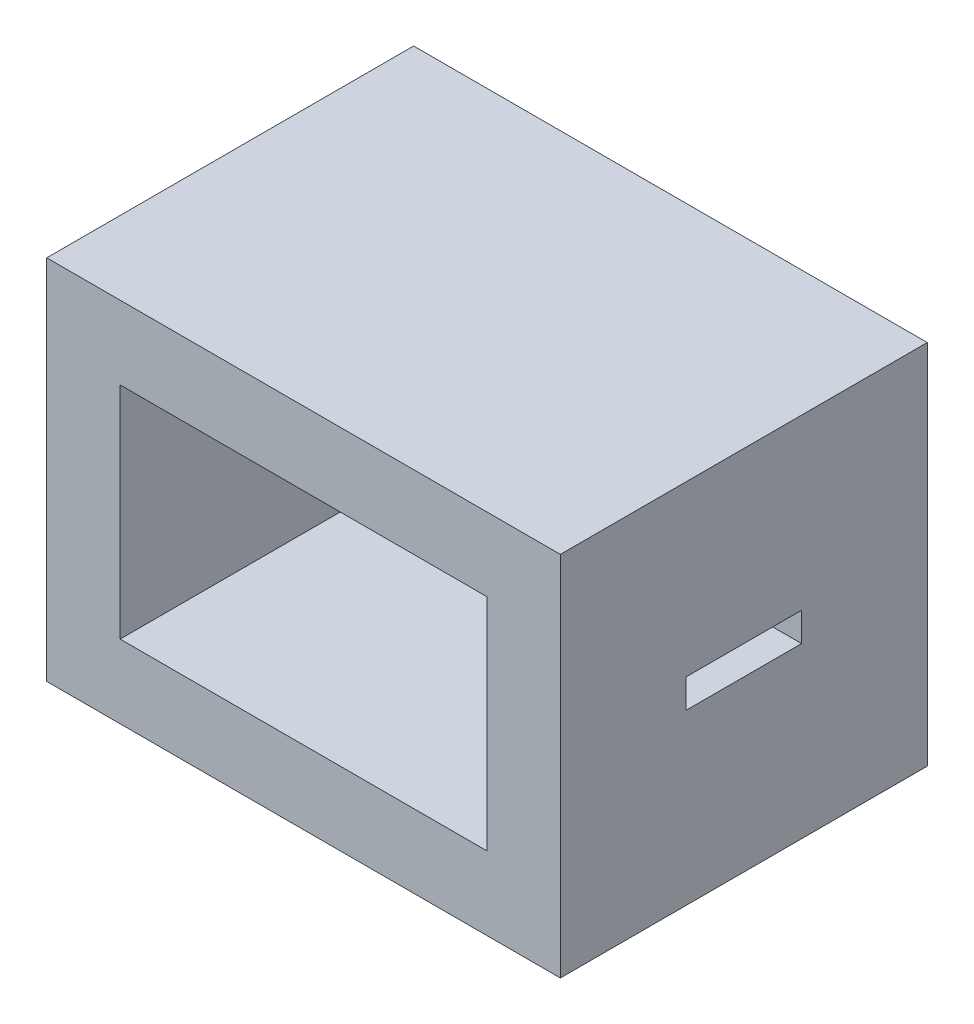
ISO-10303-21;
HEADER;
FILE_DESCRIPTION(('STEP AP214'),'2;1');
FILE_NAME('part.step','',(''),(''),'','','');
FILE_SCHEMA(('AUTOMOTIVE_DESIGN { 1 0 10303 214 1 1 1 1 }'));
ENDSEC;
DATA;
#1=APPLICATION_CONTEXT('core data for automotive mechanical design processes');
#2=APPLICATION_PROTOCOL_DEFINITION('international standard','automotive_design',2000,#1);
#3=PRODUCT_CONTEXT('',#1,'mechanical');
#4=PRODUCT('Part','Part','',(#3));
#5=PRODUCT_RELATED_PRODUCT_CATEGORY('part','',(#4));
#6=PRODUCT_DEFINITION_FORMATION('','',#4);
#7=PRODUCT_DEFINITION_CONTEXT('part definition',#1,'design');
#8=PRODUCT_DEFINITION('design','',#6,#7);
#9=PRODUCT_DEFINITION_SHAPE('','',#8);
#10=(LENGTH_UNIT() NAMED_UNIT(*) SI_UNIT(.MILLI.,.METRE.));
#11=(NAMED_UNIT(*) PLANE_ANGLE_UNIT() SI_UNIT($,.RADIAN.));
#12=(NAMED_UNIT(*) SI_UNIT($,.STERADIAN.) SOLID_ANGLE_UNIT());
#13=UNCERTAINTY_MEASURE_WITH_UNIT(LENGTH_MEASURE(1.E-05),#10,'distance_accuracy_value','');
#14=(GEOMETRIC_REPRESENTATION_CONTEXT(3) GLOBAL_UNCERTAINTY_ASSIGNED_CONTEXT((#13)) GLOBAL_UNIT_ASSIGNED_CONTEXT((#10,
#11,#12)) REPRESENTATION_CONTEXT('',''));
#15=CARTESIAN_POINT('',(0.,0.,0.));
#16=DIRECTION('',(0.,0.,1.));
#17=DIRECTION('',(1.,0.,0.));
#18=AXIS2_PLACEMENT_3D('',#15,#16,#17);
#19=CARTESIAN_POINT('',(2.54,0.,0.));
#20=DIRECTION('',(1.,0.,0.));
#21=DIRECTION('',(0.,0.,-1.));
#22=AXIS2_PLACEMENT_3D('',#19,#20,#21);
#23=PLANE('',#22);
#24=DIRECTION('',(0.,1.,0.));
#25=VECTOR('',#24,1.);
#26=CARTESIAN_POINT('',(2.54,0.5,-2.));
#27=LINE('',#26,#25);
#28=CARTESIAN_POINT('',(2.54,-0.5,-2.));
#29=VERTEX_POINT('',#28);
#30=CARTESIAN_POINT('',(2.54,0.5,-2.));
#31=VERTEX_POINT('',#30);
#32=EDGE_CURVE('E272',#29,#31,#27,.T.);
#33=ORIENTED_EDGE('',*,*,#32,.F.);
#34=DIRECTION('',(0.,0.,-1.));
#35=VECTOR('',#34,1.);
#36=CARTESIAN_POINT('',(2.54,-0.5,2.));
#37=LINE('',#36,#35);
#38=CARTESIAN_POINT('',(2.54,-0.5,2.));
#39=VERTEX_POINT('',#38);
#40=EDGE_CURVE('E278',#39,#29,#37,.T.);
#41=ORIENTED_EDGE('',*,*,#40,.F.);
#42=DIRECTION('',(0.,-1.,0.));
#43=VECTOR('',#42,1.);
#44=CARTESIAN_POINT('',(2.54,0.5,2.));
#45=LINE('',#44,#43);
#46=CARTESIAN_POINT('',(2.54,0.5,2.));
#47=VERTEX_POINT('',#46);
#48=EDGE_CURVE('E296',#47,#39,#45,.T.);
#49=ORIENTED_EDGE('',*,*,#48,.F.);
#50=DIRECTION('',(0.,0.,1.));
#51=VECTOR('',#50,1.);
#52=CARTESIAN_POINT('',(2.54,0.5,2.));
#53=LINE('',#52,#51);
#54=EDGE_CURVE('E292',#31,#47,#53,.T.);
#55=ORIENTED_EDGE('',*,*,#54,.F.);
#56=EDGE_LOOP('',(#33,#41,#49,#55));
#57=FACE_BOUND('',#56,.T.);
#58=DIRECTION('',(0.,0.,-1.));
#59=VECTOR('',#58,1.);
#60=CARTESIAN_POINT('',(2.54,-3.81,6.35));
#61=LINE('',#60,#59);
#62=CARTESIAN_POINT('',(2.54,-3.81,6.35));
#63=VERTEX_POINT('',#62);
#64=CARTESIAN_POINT('',(2.54,-3.81,-3.81));
#65=VERTEX_POINT('',#64);
#66=EDGE_CURVE('E249',#63,#65,#61,.T.);
#67=ORIENTED_EDGE('',*,*,#66,.T.);
#68=DIRECTION('',(0.,1.,0.));
#69=VECTOR('',#68,1.);
#70=CARTESIAN_POINT('',(2.54,3.81,-3.81));
#71=LINE('',#70,#69);
#72=CARTESIAN_POINT('',(2.54,3.81,-3.81));
#73=VERTEX_POINT('',#72);
#74=EDGE_CURVE('E241',#65,#73,#71,.T.);
#75=ORIENTED_EDGE('',*,*,#74,.T.);
#76=DIRECTION('',(0.,0.,1.));
#77=VECTOR('',#76,1.);
#78=CARTESIAN_POINT('',(2.54,3.81,-6.35));
#79=LINE('',#78,#77);
#80=CARTESIAN_POINT('',(2.54,3.81,6.35));
#81=VERTEX_POINT('',#80);
#82=EDGE_CURVE('E261',#73,#81,#79,.T.);
#83=ORIENTED_EDGE('',*,*,#82,.T.);
#84=DIRECTION('',(0.,-1.,0.));
#85=VECTOR('',#84,1.);
#86=CARTESIAN_POINT('',(2.54,6.35,6.35));
#87=LINE('',#86,#85);
#88=EDGE_CURVE('E316',#81,#63,#87,.T.);
#89=ORIENTED_EDGE('',*,*,#88,.T.);
#90=EDGE_LOOP('',(#67,#75,#83,#89));
#91=FACE_BOUND('',#90,.T.);
#92=ADVANCED_FACE('F49',(#57,#91),#23,.T.);
#93=CARTESIAN_POINT('',(0.,3.81,0.));
#94=DIRECTION('',(0.,1.,0.));
#95=DIRECTION('',(0.,0.,1.));
#96=AXIS2_PLACEMENT_3D('',#93,#94,#95);
#97=PLANE('',#96);
#98=DIRECTION('',(1.,0.,0.));
#99=VECTOR('',#98,1.);
#100=CARTESIAN_POINT('',(15.24,3.81,-3.81));
#101=LINE('',#100,#99);
#102=CARTESIAN_POINT('',(15.24,3.81,-3.81));
#103=VERTEX_POINT('',#102);
#104=EDGE_CURVE('E245',#73,#103,#101,.T.);
#105=ORIENTED_EDGE('',*,*,#104,.T.);
#106=DIRECTION('',(0.,0.,-1.));
#107=VECTOR('',#106,1.);
#108=CARTESIAN_POINT('',(15.24,3.81,-6.35));
#109=LINE('',#108,#107);
#110=CARTESIAN_POINT('',(15.24,3.81,6.35));
#111=VERTEX_POINT('',#110);
#112=EDGE_CURVE('E268',#111,#103,#109,.T.);
#113=ORIENTED_EDGE('',*,*,#112,.F.);
#114=DIRECTION('',(1.,0.,0.));
#115=VECTOR('',#114,1.);
#116=CARTESIAN_POINT('',(2.54,3.81,6.35));
#117=LINE('',#116,#115);
#118=EDGE_CURVE('E264',#81,#111,#117,.T.);
#119=ORIENTED_EDGE('',*,*,#118,.F.);
#120=ORIENTED_EDGE('',*,*,#82,.F.);
#121=EDGE_LOOP('',(#105,#113,#119,#120));
#122=FACE_BOUND('',#121,.T.);
#123=ADVANCED_FACE('F365',(#122),#97,.F.);
#124=CARTESIAN_POINT('',(0.,-3.81,0.));
#125=DIRECTION('',(0.,-1.,0.));
#126=DIRECTION('',(0.,0.,-1.));
#127=AXIS2_PLACEMENT_3D('',#124,#125,#126);
#128=PLANE('',#127);
#129=DIRECTION('',(-1.,0.,0.));
#130=VECTOR('',#129,1.);
#131=CARTESIAN_POINT('',(15.24,-3.81,-3.81));
#132=LINE('',#131,#130);
#133=CARTESIAN_POINT('',(15.24,-3.81,-3.81));
#134=VERTEX_POINT('',#133);
#135=EDGE_CURVE('E237',#134,#65,#132,.T.);
#136=ORIENTED_EDGE('',*,*,#135,.T.);
#137=ORIENTED_EDGE('',*,*,#66,.F.);
#138=DIRECTION('',(-1.,0.,0.));
#139=VECTOR('',#138,1.);
#140=CARTESIAN_POINT('',(2.54,-3.81,6.35));
#141=LINE('',#140,#139);
#142=CARTESIAN_POINT('',(15.24,-3.81,6.35));
#143=VERTEX_POINT('',#142);
#144=EDGE_CURVE('E257',#143,#63,#141,.T.);
#145=ORIENTED_EDGE('',*,*,#144,.F.);
#146=DIRECTION('',(0.,0.,1.));
#147=VECTOR('',#146,1.);
#148=CARTESIAN_POINT('',(15.24,-3.81,6.35));
#149=LINE('',#148,#147);
#150=EDGE_CURVE('E253',#134,#143,#149,.T.);
#151=ORIENTED_EDGE('',*,*,#150,.F.);
#152=EDGE_LOOP('',(#136,#137,#145,#151));
#153=FACE_BOUND('',#152,.T.);
#154=ADVANCED_FACE('F363',(#153),#128,.F.);
#155=CARTESIAN_POINT('',(2.54,6.35,-6.35));
#156=DIRECTION('',(0.,0.,1.));
#157=DIRECTION('',(0.,-1.,0.));
#158=AXIS2_PLACEMENT_3D('',#155,#156,#157);
#159=PLANE('',#158);
#160=DIRECTION('',(0.,1.,0.));
#161=VECTOR('',#160,1.);
#162=CARTESIAN_POINT('',(0.,6.35,-6.35));
#163=LINE('',#162,#161);
#164=CARTESIAN_POINT('',(0.,-6.35,-6.35));
#165=VERTEX_POINT('',#164);
#166=CARTESIAN_POINT('',(0.,6.35,-6.35));
#167=VERTEX_POINT('',#166);
#168=EDGE_CURVE('E306',#165,#167,#163,.T.);
#169=ORIENTED_EDGE('',*,*,#168,.T.);
#170=DIRECTION('',(-1.,0.,0.));
#171=VECTOR('',#170,1.);
#172=CARTESIAN_POINT('',(2.54,6.35,-6.35));
#173=LINE('',#172,#171);
#174=CARTESIAN_POINT('',(17.78,6.35,-6.35));
#175=VERTEX_POINT('',#174);
#176=EDGE_CURVE('E11',#175,#167,#173,.T.);
#177=ORIENTED_EDGE('',*,*,#176,.F.);
#178=DIRECTION('',(0.,1.,0.));
#179=VECTOR('',#178,1.);
#180=CARTESIAN_POINT('',(17.78,6.35,-6.35));
#181=LINE('',#180,#179);
#182=CARTESIAN_POINT('',(17.78,-6.35,-6.35));
#183=VERTEX_POINT('',#182);
#184=EDGE_CURVE('E223',#183,#175,#181,.T.);
#185=ORIENTED_EDGE('',*,*,#184,.F.);
#186=DIRECTION('',(-1.,0.,0.));
#187=VECTOR('',#186,1.);
#188=CARTESIAN_POINT('',(2.54,-6.35,-6.35));
#189=LINE('',#188,#187);
#190=EDGE_CURVE('E319',#183,#165,#189,.T.);
#191=ORIENTED_EDGE('',*,*,#190,.T.);
#192=EDGE_LOOP('',(#169,#177,#185,#191));
#193=FACE_BOUND('',#192,.T.);
#194=ADVANCED_FACE('F51',(#193),#159,.F.);
#195=CARTESIAN_POINT('',(2.54,6.35,6.35));
#196=DIRECTION('',(0.,-1.,0.));
#197=DIRECTION('',(0.,0.,-1.));
#198=AXIS2_PLACEMENT_3D('',#195,#196,#197);
#199=PLANE('',#198);
#200=DIRECTION('',(0.,0.,1.));
#201=VECTOR('',#200,1.);
#202=CARTESIAN_POINT('',(0.,6.35,6.35));
#203=LINE('',#202,#201);
#204=CARTESIAN_POINT('',(0.,6.35,6.35));
#205=VERTEX_POINT('',#204);
#206=EDGE_CURVE('E324',#167,#205,#203,.T.);
#207=ORIENTED_EDGE('',*,*,#206,.T.);
#208=DIRECTION('',(-1.,0.,0.));
#209=VECTOR('',#208,1.);
#210=CARTESIAN_POINT('',(2.54,6.35,6.35));
#211=LINE('',#210,#209);
#212=CARTESIAN_POINT('',(17.78,6.35,6.35));
#213=VERTEX_POINT('',#212);
#214=EDGE_CURVE('E58',#213,#205,#211,.T.);
#215=ORIENTED_EDGE('',*,*,#214,.F.);
#216=DIRECTION('',(0.,0.,1.));
#217=VECTOR('',#216,1.);
#218=CARTESIAN_POINT('',(17.78,6.35,6.35));
#219=LINE('',#218,#217);
#220=EDGE_CURVE('E227',#175,#213,#219,.T.);
#221=ORIENTED_EDGE('',*,*,#220,.F.);
#222=ORIENTED_EDGE('',*,*,#176,.T.);
#223=EDGE_LOOP('',(#207,#215,#221,#222));
#224=FACE_BOUND('',#223,.T.);
#225=ADVANCED_FACE('F357',(#224),#199,.F.);
#226=CARTESIAN_POINT('',(2.54,6.35,6.35));
#227=DIRECTION('',(0.,0.,-1.));
#228=DIRECTION('',(0.,1.,0.));
#229=AXIS2_PLACEMENT_3D('',#226,#227,#228);
#230=PLANE('',#229);
#231=DIRECTION('',(0.,-1.,0.));
#232=VECTOR('',#231,1.);
#233=CARTESIAN_POINT('',(17.78,6.35,6.35));
#234=LINE('',#233,#232);
#235=CARTESIAN_POINT('',(17.78,-6.35,6.35));
#236=VERTEX_POINT('',#235);
#237=EDGE_CURVE('E215',#213,#236,#234,.T.);
#238=ORIENTED_EDGE('',*,*,#237,.F.);
#239=ORIENTED_EDGE('',*,*,#214,.T.);
#240=DIRECTION('',(0.,-1.,0.));
#241=VECTOR('',#240,1.);
#242=CARTESIAN_POINT('',(0.,6.35,6.35));
#243=LINE('',#242,#241);
#244=CARTESIAN_POINT('',(0.,-6.35,6.35));
#245=VERTEX_POINT('',#244);
#246=EDGE_CURVE('E327',#205,#245,#243,.T.);
#247=ORIENTED_EDGE('',*,*,#246,.T.);
#248=DIRECTION('',(-1.,0.,0.));
#249=VECTOR('',#248,1.);
#250=CARTESIAN_POINT('',(2.54,-6.35,6.35));
#251=LINE('',#250,#249);
#252=EDGE_CURVE('E335',#236,#245,#251,.T.);
#253=ORIENTED_EDGE('',*,*,#252,.F.);
#254=EDGE_LOOP('',(#238,#239,#247,#253));
#255=FACE_BOUND('',#254,.T.);
#256=ORIENTED_EDGE('',*,*,#118,.T.);
#257=DIRECTION('',(0.,-1.,0.));
#258=VECTOR('',#257,1.);
#259=CARTESIAN_POINT('',(15.24,6.35,6.35));
#260=LINE('',#259,#258);
#261=EDGE_CURVE('E209',#111,#143,#260,.T.);
#262=ORIENTED_EDGE('',*,*,#261,.T.);
#263=ORIENTED_EDGE('',*,*,#144,.T.);
#264=ORIENTED_EDGE('',*,*,#88,.F.);
#265=EDGE_LOOP('',(#256,#262,#263,#264));
#266=FACE_BOUND('',#265,.T.);
#267=ADVANCED_FACE('F344',(#255,#266),#230,.F.);
#268=CARTESIAN_POINT('',(2.54,-6.35,6.35));
#269=DIRECTION('',(0.,1.,0.));
#270=DIRECTION('',(0.,0.,1.));
#271=AXIS2_PLACEMENT_3D('',#268,#269,#270);
#272=PLANE('',#271);
#273=DIRECTION('',(0.,0.,-1.));
#274=VECTOR('',#273,1.);
#275=CARTESIAN_POINT('',(0.,-6.35,6.35));
#276=LINE('',#275,#274);
#277=EDGE_CURVE('E320',#245,#165,#276,.T.);
#278=ORIENTED_EDGE('',*,*,#277,.T.);
#279=ORIENTED_EDGE('',*,*,#190,.F.);
#280=DIRECTION('',(0.,0.,-1.));
#281=VECTOR('',#280,1.);
#282=CARTESIAN_POINT('',(17.78,-6.35,6.35));
#283=LINE('',#282,#281);
#284=EDGE_CURVE('E219',#236,#183,#283,.T.);
#285=ORIENTED_EDGE('',*,*,#284,.F.);
#286=ORIENTED_EDGE('',*,*,#252,.T.);
#287=EDGE_LOOP('',(#278,#279,#285,#286));
#288=FACE_BOUND('',#287,.T.);
#289=ADVANCED_FACE('F353',(#288),#272,.F.);
#290=CARTESIAN_POINT('',(0.,0.,0.));
#291=DIRECTION('',(1.,0.,0.));
#292=DIRECTION('',(0.,0.,-1.));
#293=AXIS2_PLACEMENT_3D('',#290,#291,#292);
#294=PLANE('',#293);
#295=DIRECTION('',(0.,0.,-1.));
#296=VECTOR('',#295,1.);
#297=CARTESIAN_POINT('',(0.,-0.5,2.));
#298=LINE('',#297,#296);
#299=CARTESIAN_POINT('',(0.,-0.5,2.));
#300=VERTEX_POINT('',#299);
#301=CARTESIAN_POINT('',(0.,-0.5,-2.));
#302=VERTEX_POINT('',#301);
#303=EDGE_CURVE('E286',#300,#302,#298,.T.);
#304=ORIENTED_EDGE('',*,*,#303,.T.);
#305=DIRECTION('',(0.,1.,0.));
#306=VECTOR('',#305,1.);
#307=CARTESIAN_POINT('',(0.,0.5,-2.));
#308=LINE('',#307,#306);
#309=CARTESIAN_POINT('',(0.,0.5,-2.));
#310=VERTEX_POINT('',#309);
#311=EDGE_CURVE('E273',#302,#310,#308,.T.);
#312=ORIENTED_EDGE('',*,*,#311,.T.);
#313=DIRECTION('',(0.,0.,1.));
#314=VECTOR('',#313,1.);
#315=CARTESIAN_POINT('',(0.,0.5,2.));
#316=LINE('',#315,#314);
#317=CARTESIAN_POINT('',(0.,0.5,2.));
#318=VERTEX_POINT('',#317);
#319=EDGE_CURVE('E277',#310,#318,#316,.T.);
#320=ORIENTED_EDGE('',*,*,#319,.T.);
#321=DIRECTION('',(0.,-1.,0.));
#322=VECTOR('',#321,1.);
#323=CARTESIAN_POINT('',(0.,0.5,2.));
#324=LINE('',#323,#322);
#325=EDGE_CURVE('E282',#318,#300,#324,.T.);
#326=ORIENTED_EDGE('',*,*,#325,.T.);
#327=EDGE_LOOP('',(#304,#312,#320,#326));
#328=FACE_BOUND('',#327,.T.);
#329=ORIENTED_EDGE('',*,*,#168,.F.);
#330=ORIENTED_EDGE('',*,*,#277,.F.);
#331=ORIENTED_EDGE('',*,*,#246,.F.);
#332=ORIENTED_EDGE('',*,*,#206,.F.);
#333=EDGE_LOOP('',(#329,#330,#331,#332));
#334=FACE_BOUND('',#333,.T.);
#335=ADVANCED_FACE('F351',(#328,#334),#294,.F.);
#336=CARTESIAN_POINT('',(0.,0.5,-2.));
#337=DIRECTION('',(0.,0.,-1.));
#338=DIRECTION('',(-1.,0.,0.));
#339=AXIS2_PLACEMENT_3D('',#336,#337,#338);
#340=PLANE('',#339);
#341=ORIENTED_EDGE('',*,*,#32,.T.);
#342=DIRECTION('',(1.,0.,0.));
#343=VECTOR('',#342,1.);
#344=CARTESIAN_POINT('',(0.,0.5,-2.));
#345=LINE('',#344,#343);
#346=EDGE_CURVE('E290',#310,#31,#345,.T.);
#347=ORIENTED_EDGE('',*,*,#346,.F.);
#348=ORIENTED_EDGE('',*,*,#311,.F.);
#349=DIRECTION('',(1.,0.,0.));
#350=VECTOR('',#349,1.);
#351=CARTESIAN_POINT('',(0.,-0.5,-2.));
#352=LINE('',#351,#350);
#353=EDGE_CURVE('E303',#302,#29,#352,.T.);
#354=ORIENTED_EDGE('',*,*,#353,.T.);
#355=EDGE_LOOP('',(#341,#347,#348,#354));
#356=FACE_BOUND('',#355,.T.);
#357=ADVANCED_FACE('F376',(#356),#340,.F.);
#358=CARTESIAN_POINT('',(0.,-0.5,2.));
#359=DIRECTION('',(0.,-1.,0.));
#360=DIRECTION('',(0.,0.,-1.));
#361=AXIS2_PLACEMENT_3D('',#358,#359,#360);
#362=PLANE('',#361);
#363=ORIENTED_EDGE('',*,*,#40,.T.);
#364=ORIENTED_EDGE('',*,*,#353,.F.);
#365=ORIENTED_EDGE('',*,*,#303,.F.);
#366=DIRECTION('',(1.,0.,0.));
#367=VECTOR('',#366,1.);
#368=CARTESIAN_POINT('',(0.,-0.5,2.));
#369=LINE('',#368,#367);
#370=EDGE_CURVE('E307',#300,#39,#369,.T.);
#371=ORIENTED_EDGE('',*,*,#370,.T.);
#372=EDGE_LOOP('',(#363,#364,#365,#371));
#373=FACE_BOUND('',#372,.T.);
#374=ADVANCED_FACE('F393',(#373),#362,.F.);
#375=CARTESIAN_POINT('',(0.,0.5,2.));
#376=DIRECTION('',(0.,0.,1.));
#377=DIRECTION('',(1.,0.,0.));
#378=AXIS2_PLACEMENT_3D('',#375,#376,#377);
#379=PLANE('',#378);
#380=ORIENTED_EDGE('',*,*,#48,.T.);
#381=ORIENTED_EDGE('',*,*,#370,.F.);
#382=ORIENTED_EDGE('',*,*,#325,.F.);
#383=DIRECTION('',(1.,0.,0.));
#384=VECTOR('',#383,1.);
#385=CARTESIAN_POINT('',(0.,0.5,2.));
#386=LINE('',#385,#384);
#387=EDGE_CURVE('E310',#318,#47,#386,.T.);
#388=ORIENTED_EDGE('',*,*,#387,.T.);
#389=EDGE_LOOP('',(#380,#381,#382,#388));
#390=FACE_BOUND('',#389,.T.);
#391=ADVANCED_FACE('F399',(#390),#379,.F.);
#392=CARTESIAN_POINT('',(0.,0.5,2.));
#393=DIRECTION('',(0.,1.,0.));
#394=DIRECTION('',(0.,0.,1.));
#395=AXIS2_PLACEMENT_3D('',#392,#393,#394);
#396=PLANE('',#395);
#397=ORIENTED_EDGE('',*,*,#54,.T.);
#398=ORIENTED_EDGE('',*,*,#387,.F.);
#399=ORIENTED_EDGE('',*,*,#319,.F.);
#400=ORIENTED_EDGE('',*,*,#346,.T.);
#401=EDGE_LOOP('',(#397,#398,#399,#400));
#402=FACE_BOUND('',#401,.T.);
#403=ADVANCED_FACE('F406',(#402),#396,.F.);
#404=CARTESIAN_POINT('',(0.,0.,-3.81));
#405=DIRECTION('',(0.,0.,-1.));
#406=DIRECTION('',(0.,1.,0.));
#407=AXIS2_PLACEMENT_3D('',#404,#405,#406);
#408=PLANE('',#407);
#409=DIRECTION('',(0.,-1.,0.));
#410=VECTOR('',#409,1.);
#411=CARTESIAN_POINT('',(15.24,3.81,-3.81));
#412=LINE('',#411,#410);
#413=EDGE_CURVE('E230',#103,#134,#412,.T.);
#414=ORIENTED_EDGE('',*,*,#413,.F.);
#415=ORIENTED_EDGE('',*,*,#104,.F.);
#416=ORIENTED_EDGE('',*,*,#74,.F.);
#417=ORIENTED_EDGE('',*,*,#135,.F.);
#418=EDGE_LOOP('',(#414,#415,#416,#417));
#419=FACE_BOUND('',#418,.T.);
#420=ADVANCED_FACE('F413',(#419),#408,.F.);
#421=CARTESIAN_POINT('',(15.24,0.,0.));
#422=DIRECTION('',(1.,0.,0.));
#423=DIRECTION('',(0.,0.,-1.));
#424=AXIS2_PLACEMENT_3D('',#421,#422,#423);
#425=PLANE('',#424);
#426=DIRECTION('',(0.,0.,1.));
#427=VECTOR('',#426,1.);
#428=CARTESIAN_POINT('',(15.24,-0.5,-2.));
#429=LINE('',#428,#427);
#430=CARTESIAN_POINT('',(15.24,-0.5,-2.));
#431=VERTEX_POINT('',#430);
#432=CARTESIAN_POINT('',(15.24,-0.5,2.));
#433=VERTEX_POINT('',#432);
#434=EDGE_CURVE('E200',#431,#433,#429,.T.);
#435=ORIENTED_EDGE('',*,*,#434,.F.);
#436=DIRECTION('',(0.,-1.,0.));
#437=VECTOR('',#436,1.);
#438=CARTESIAN_POINT('',(15.24,0.5,-2.));
#439=LINE('',#438,#437);
#440=CARTESIAN_POINT('',(15.24,0.5,-2.));
#441=VERTEX_POINT('',#440);
#442=EDGE_CURVE('E65',#441,#431,#439,.T.);
#443=ORIENTED_EDGE('',*,*,#442,.F.);
#444=DIRECTION('',(0.,0.,-1.));
#445=VECTOR('',#444,1.);
#446=CARTESIAN_POINT('',(15.24,0.5,-2.));
#447=LINE('',#446,#445);
#448=CARTESIAN_POINT('',(15.24,0.5,2.));
#449=VERTEX_POINT('',#448);
#450=EDGE_CURVE('E184',#449,#441,#447,.T.);
#451=ORIENTED_EDGE('',*,*,#450,.F.);
#452=DIRECTION('',(0.,1.,0.));
#453=VECTOR('',#452,1.);
#454=CARTESIAN_POINT('',(15.24,0.5,2.));
#455=LINE('',#454,#453);
#456=EDGE_CURVE('E191',#433,#449,#455,.T.);
#457=ORIENTED_EDGE('',*,*,#456,.F.);
#458=EDGE_LOOP('',(#435,#443,#451,#457));
#459=FACE_BOUND('',#458,.T.);
#460=ORIENTED_EDGE('',*,*,#261,.F.);
#461=ORIENTED_EDGE('',*,*,#112,.T.);
#462=ORIENTED_EDGE('',*,*,#413,.T.);
#463=ORIENTED_EDGE('',*,*,#150,.T.);
#464=EDGE_LOOP('',(#460,#461,#462,#463));
#465=FACE_BOUND('',#464,.T.);
#466=ADVANCED_FACE('F418',(#459,#465),#425,.F.);
#467=CARTESIAN_POINT('',(17.78,0.,0.));
#468=DIRECTION('',(1.,0.,0.));
#469=DIRECTION('',(0.,0.,-1.));
#470=AXIS2_PLACEMENT_3D('',#467,#468,#469);
#471=PLANE('',#470);
#472=DIRECTION('',(0.,-1.,0.));
#473=VECTOR('',#472,1.);
#474=CARTESIAN_POINT('',(17.78,0.5,-2.));
#475=LINE('',#474,#473);
#476=CARTESIAN_POINT('',(17.78,0.5,-2.));
#477=VERTEX_POINT('',#476);
#478=CARTESIAN_POINT('',(17.78,-0.5,-2.));
#479=VERTEX_POINT('',#478);
#480=EDGE_CURVE('E165',#477,#479,#475,.T.);
#481=ORIENTED_EDGE('',*,*,#480,.T.);
#482=DIRECTION('',(0.,0.,1.));
#483=VECTOR('',#482,1.);
#484=CARTESIAN_POINT('',(17.78,-0.5,-2.));
#485=LINE('',#484,#483);
#486=CARTESIAN_POINT('',(17.78,-0.5,2.));
#487=VERTEX_POINT('',#486);
#488=EDGE_CURVE('E175',#479,#487,#485,.T.);
#489=ORIENTED_EDGE('',*,*,#488,.T.);
#490=DIRECTION('',(0.,1.,0.));
#491=VECTOR('',#490,1.);
#492=CARTESIAN_POINT('',(17.78,0.5,2.));
#493=LINE('',#492,#491);
#494=CARTESIAN_POINT('',(17.78,0.5,2.));
#495=VERTEX_POINT('',#494);
#496=EDGE_CURVE('E73',#487,#495,#493,.T.);
#497=ORIENTED_EDGE('',*,*,#496,.T.);
#498=DIRECTION('',(0.,0.,-1.));
#499=VECTOR('',#498,1.);
#500=CARTESIAN_POINT('',(17.78,0.5,-2.));
#501=LINE('',#500,#499);
#502=EDGE_CURVE('E172',#495,#477,#501,.T.);
#503=ORIENTED_EDGE('',*,*,#502,.T.);
#504=EDGE_LOOP('',(#481,#489,#497,#503));
#505=FACE_BOUND('',#504,.T.);
#506=ORIENTED_EDGE('',*,*,#237,.T.);
#507=ORIENTED_EDGE('',*,*,#284,.T.);
#508=ORIENTED_EDGE('',*,*,#184,.T.);
#509=ORIENTED_EDGE('',*,*,#220,.T.);
#510=EDGE_LOOP('',(#506,#507,#508,#509));
#511=FACE_BOUND('',#510,.T.);
#512=ADVANCED_FACE('F180',(#505,#511),#471,.T.);
#513=CARTESIAN_POINT('',(17.78,0.5,-2.));
#514=DIRECTION('',(0.,0.,-1.));
#515=DIRECTION('',(-1.,0.,0.));
#516=AXIS2_PLACEMENT_3D('',#513,#514,#515);
#517=PLANE('',#516);
#518=ORIENTED_EDGE('',*,*,#442,.T.);
#519=DIRECTION('',(-1.,0.,0.));
#520=VECTOR('',#519,1.);
#521=CARTESIAN_POINT('',(17.78,-0.5,-2.));
#522=LINE('',#521,#520);
#523=EDGE_CURVE('E161',#479,#431,#522,.T.);
#524=ORIENTED_EDGE('',*,*,#523,.F.);
#525=ORIENTED_EDGE('',*,*,#480,.F.);
#526=DIRECTION('',(-1.,0.,0.));
#527=VECTOR('',#526,1.);
#528=CARTESIAN_POINT('',(17.78,0.5,-2.));
#529=LINE('',#528,#527);
#530=EDGE_CURVE('E206',#477,#441,#529,.T.);
#531=ORIENTED_EDGE('',*,*,#530,.T.);
#532=EDGE_LOOP('',(#518,#524,#525,#531));
#533=FACE_BOUND('',#532,.T.);
#534=ADVANCED_FACE('F163',(#533),#517,.F.);
#535=CARTESIAN_POINT('',(17.78,0.5,-2.));
#536=DIRECTION('',(0.,1.,0.));
#537=DIRECTION('',(0.,0.,1.));
#538=AXIS2_PLACEMENT_3D('',#535,#536,#537);
#539=PLANE('',#538);
#540=ORIENTED_EDGE('',*,*,#450,.T.);
#541=ORIENTED_EDGE('',*,*,#530,.F.);
#542=ORIENTED_EDGE('',*,*,#502,.F.);
#543=DIRECTION('',(-1.,0.,0.));
#544=VECTOR('',#543,1.);
#545=CARTESIAN_POINT('',(17.78,0.5,2.));
#546=LINE('',#545,#544);
#547=EDGE_CURVE('E210',#495,#449,#546,.T.);
#548=ORIENTED_EDGE('',*,*,#547,.T.);
#549=EDGE_LOOP('',(#540,#541,#542,#548));
#550=FACE_BOUND('',#549,.T.);
#551=ADVANCED_FACE('F436',(#550),#539,.F.);
#552=CARTESIAN_POINT('',(17.78,0.5,2.));
#553=DIRECTION('',(0.,0.,1.));
#554=DIRECTION('',(1.,0.,0.));
#555=AXIS2_PLACEMENT_3D('',#552,#553,#554);
#556=PLANE('',#555);
#557=ORIENTED_EDGE('',*,*,#456,.T.);
#558=ORIENTED_EDGE('',*,*,#547,.F.);
#559=ORIENTED_EDGE('',*,*,#496,.F.);
#560=DIRECTION('',(-1.,0.,0.));
#561=VECTOR('',#560,1.);
#562=CARTESIAN_POINT('',(17.78,-0.5,2.));
#563=LINE('',#562,#561);
#564=EDGE_CURVE('E171',#487,#433,#563,.T.);
#565=ORIENTED_EDGE('',*,*,#564,.T.);
#566=EDGE_LOOP('',(#557,#558,#559,#565));
#567=FACE_BOUND('',#566,.T.);
#568=ADVANCED_FACE('F442',(#567),#556,.F.);
#569=CARTESIAN_POINT('',(17.78,-0.5,-2.));
#570=DIRECTION('',(0.,-1.,0.));
#571=DIRECTION('',(0.,0.,-1.));
#572=AXIS2_PLACEMENT_3D('',#569,#570,#571);
#573=PLANE('',#572);
#574=ORIENTED_EDGE('',*,*,#434,.T.);
#575=ORIENTED_EDGE('',*,*,#564,.F.);
#576=ORIENTED_EDGE('',*,*,#488,.F.);
#577=ORIENTED_EDGE('',*,*,#523,.T.);
#578=EDGE_LOOP('',(#574,#575,#576,#577));
#579=FACE_BOUND('',#578,.T.);
#580=ADVANCED_FACE('F176',(#579),#573,.F.);
#581=CLOSED_SHELL('',(#92,#123,#154,#194,#225,#267,#289,#335,#357,#374,#391,#403,#420,#466,#512,
#534,#551,#568,#580));
#582=MANIFOLD_SOLID_BREP('B2',#581);
#583=ADVANCED_BREP_SHAPE_REPRESENTATION('',(#18,#582),#14);
#584=SHAPE_DEFINITION_REPRESENTATION(#9,#583);
ENDSEC;
END-ISO-10303-21;
